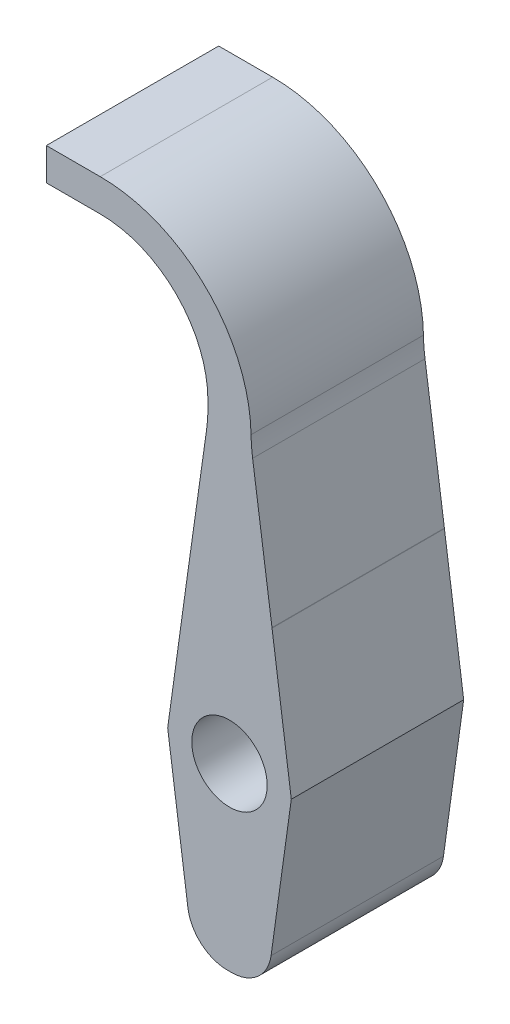
ISO-10303-21;
HEADER;
FILE_DESCRIPTION(('STEP AP214'),'2;1');
FILE_NAME('part.step','',(''),(''),'','','');
FILE_SCHEMA(('AUTOMOTIVE_DESIGN { 1 0 10303 214 1 1 1 1 }'));
ENDSEC;
DATA;
#1=APPLICATION_CONTEXT('core data for automotive mechanical design processes');
#2=APPLICATION_PROTOCOL_DEFINITION('international standard','automotive_design',2000,#1);
#3=PRODUCT_CONTEXT('',#1,'mechanical');
#4=PRODUCT('Part','Part','',(#3));
#5=PRODUCT_RELATED_PRODUCT_CATEGORY('part','',(#4));
#6=PRODUCT_DEFINITION_FORMATION('','',#4);
#7=PRODUCT_DEFINITION_CONTEXT('part definition',#1,'design');
#8=PRODUCT_DEFINITION('design','',#6,#7);
#9=PRODUCT_DEFINITION_SHAPE('','',#8);
#10=(LENGTH_UNIT() NAMED_UNIT(*) SI_UNIT(.MILLI.,.METRE.));
#11=(NAMED_UNIT(*) PLANE_ANGLE_UNIT() SI_UNIT($,.RADIAN.));
#12=(NAMED_UNIT(*) SI_UNIT($,.STERADIAN.) SOLID_ANGLE_UNIT());
#13=UNCERTAINTY_MEASURE_WITH_UNIT(LENGTH_MEASURE(1.E-05),#10,'distance_accuracy_value','');
#14=(GEOMETRIC_REPRESENTATION_CONTEXT(3) GLOBAL_UNCERTAINTY_ASSIGNED_CONTEXT((#13)) GLOBAL_UNIT_ASSIGNED_CONTEXT((#10,
#11,#12)) REPRESENTATION_CONTEXT('',''));
#15=CARTESIAN_POINT('',(0.,0.,0.));
#16=DIRECTION('',(0.,0.,1.));
#17=DIRECTION('',(1.,0.,0.));
#18=AXIS2_PLACEMENT_3D('',#15,#16,#17);
#19=CARTESIAN_POINT('',(-2.,27.7123031282186,-4.));
#20=DIRECTION('',(-1.,0.,0.));
#21=DIRECTION('',(0.,0.,1.));
#22=AXIS2_PLACEMENT_3D('',#19,#20,#21);
#23=PLANE('',#22);
#24=DIRECTION('',(0.,-1.,0.));
#25=VECTOR('',#24,1.);
#26=CARTESIAN_POINT('',(-2.,41.1780435084215,12.));
#27=LINE('',#26,#25);
#28=CARTESIAN_POINT('',(-2.,28.1780435084215,12.));
#29=VERTEX_POINT('',#28);
#30=CARTESIAN_POINT('',(-2.,27.7123031282186,12.));
#31=VERTEX_POINT('',#30);
#32=EDGE_CURVE('E292',#29,#31,#27,.T.);
#33=ORIENTED_EDGE('',*,*,#32,.F.);
#34=DIRECTION('',(0.,0.,1.));
#35=VECTOR('',#34,1.);
#36=CARTESIAN_POINT('',(-2.,28.1780435084215,-4.));
#37=LINE('',#36,#35);
#38=CARTESIAN_POINT('',(-2.,28.1780435084215,-4.));
#39=VERTEX_POINT('',#38);
#40=EDGE_CURVE('E459',#29,#39,#37,.F.);
#41=ORIENTED_EDGE('',*,*,#40,.T.);
#42=DIRECTION('',(0.,-1.,0.));
#43=VECTOR('',#42,1.);
#44=CARTESIAN_POINT('',(-2.,27.7123031282186,-4.));
#45=LINE('',#44,#43);
#46=CARTESIAN_POINT('',(-2.,27.7123031282186,-4.));
#47=VERTEX_POINT('',#46);
#48=EDGE_CURVE('E419',#39,#47,#45,.T.);
#49=ORIENTED_EDGE('',*,*,#48,.T.);
#50=DIRECTION('',(0.,0.,1.));
#51=VECTOR('',#50,1.);
#52=CARTESIAN_POINT('',(-2.,27.7123031282186,-4.));
#53=LINE('',#52,#51);
#54=EDGE_CURVE('E438',#47,#31,#53,.T.);
#55=ORIENTED_EDGE('',*,*,#54,.T.);
#56=EDGE_LOOP('',(#33,#41,#49,#55));
#57=FACE_BOUND('',#56,.T.);
#58=ADVANCED_FACE('F33',(#57),#23,.T.);
#59=CARTESIAN_POINT('',(-5.57909730046481,1.1332098290293,-4.));
#60=DIRECTION('',(-0.990498772938548,0.137521564880675,0.));
#61=DIRECTION('',(-0.137521564880675,-0.990498772938549,0.));
#62=AXIS2_PLACEMENT_3D('',#59,#60,#61);
#63=PLANE('',#62);
#64=DIRECTION('',(0.,0.,1.));
#65=VECTOR('',#64,1.);
#66=CARTESIAN_POINT('',(-5.73643297142574,0.,-4.));
#67=LINE('',#66,#65);
#68=CARTESIAN_POINT('',(-5.73643297142574,0.,-4.));
#69=VERTEX_POINT('',#68);
#70=CARTESIAN_POINT('',(-5.73643297142574,0.,12.));
#71=VERTEX_POINT('',#70);
#72=EDGE_CURVE('E430',#69,#71,#67,.T.);
#73=ORIENTED_EDGE('',*,*,#72,.T.);
#74=DIRECTION('',(-0.137521564880675,-0.990498772938548,0.));
#75=VECTOR('',#74,1.);
#76=CARTESIAN_POINT('',(-3.95049916847756,12.8631843442485,12.));
#77=LINE('',#76,#75);
#78=CARTESIAN_POINT('',(-3.95049916847756,12.8631843442485,12.));
#79=VERTEX_POINT('',#78);
#80=EDGE_CURVE('E261',#79,#71,#77,.T.);
#81=ORIENTED_EDGE('',*,*,#80,.F.);
#82=DIRECTION('',(0.,0.,1.));
#83=VECTOR('',#82,1.);
#84=CARTESIAN_POINT('',(-3.95049916847756,12.8631843442485,-4.));
#85=LINE('',#84,#83);
#86=CARTESIAN_POINT('',(-3.95049916847756,12.8631843442485,-4.));
#87=VERTEX_POINT('',#86);
#88=EDGE_CURVE('E431',#87,#79,#85,.T.);
#89=ORIENTED_EDGE('',*,*,#88,.F.);
#90=DIRECTION('',(-0.137521564880674,-0.990498772938548,0.));
#91=VECTOR('',#90,1.);
#92=CARTESIAN_POINT('',(-5.57909730046481,1.1332098290293,-4.));
#93=LINE('',#92,#91);
#94=EDGE_CURVE('E364',#87,#69,#93,.T.);
#95=ORIENTED_EDGE('',*,*,#94,.T.);
#96=EDGE_LOOP('',(#73,#81,#89,#95));
#97=FACE_BOUND('',#96,.T.);
#98=ADVANCED_FACE('F489',(#97),#63,.T.);
#99=CARTESIAN_POINT('',(10.9069824256007,10.8003608710384,-4.));
#100=DIRECTION('',(0.,0.,1.));
#101=DIRECTION('',(1.,0.,0.));
#102=AXIS2_PLACEMENT_3D('',#99,#100,#101);
#103=CYLINDRICAL_SURFACE('',#102,15.);
#104=ORIENTED_EDGE('',*,*,#88,.T.);
#105=CARTESIAN_POINT('',(10.9069824256007,10.8003608710384,12.));
#106=DIRECTION('',(0.,0.,1.));
#107=DIRECTION('',(1.,0.,0.));
#108=AXIS2_PLACEMENT_3D('',#105,#106,#107);
#109=CIRCLE('',#108,15.);
#110=CARTESIAN_POINT('',(-3.94525945999325,12.9005777578883,12.));
#111=VERTEX_POINT('',#110);
#112=EDGE_CURVE('E257',#111,#79,#109,.T.);
#113=ORIENTED_EDGE('',*,*,#112,.F.);
#114=DIRECTION('',(0.,0.,1.));
#115=VECTOR('',#114,1.);
#116=CARTESIAN_POINT('',(-3.94525945999325,12.9005777578883,-4.));
#117=LINE('',#116,#115);
#118=CARTESIAN_POINT('',(-3.94525945999325,12.9005777578883,-4.));
#119=VERTEX_POINT('',#118);
#120=EDGE_CURVE('E434',#119,#111,#117,.T.);
#121=ORIENTED_EDGE('',*,*,#120,.F.);
#122=CARTESIAN_POINT('',(10.9069824256007,10.8003608710384,-4.));
#123=DIRECTION('',(0.,0.,1.));
#124=DIRECTION('',(-1.,0.,0.));
#125=AXIS2_PLACEMENT_3D('',#122,#123,#124);
#126=CIRCLE('',#125,15.);
#127=EDGE_CURVE('E427',#119,#87,#126,.T.);
#128=ORIENTED_EDGE('',*,*,#127,.T.);
#129=EDGE_LOOP('',(#104,#113,#121,#128));
#130=FACE_BOUND('',#129,.T.);
#131=ADVANCED_FACE('F495',(#130),#103,.T.);
#132=CARTESIAN_POINT('',(-3.94525945999326,12.9005777578883,-4.));
#133=DIRECTION('',(-0.990149459039595,0.140014459123328,0.));
#134=DIRECTION('',(-0.140014459123328,-0.990149459039595,0.));
#135=AXIS2_PLACEMENT_3D('',#132,#133,#134);
#136=PLANE('',#135);
#137=ORIENTED_EDGE('',*,*,#120,.T.);
#138=DIRECTION('',(-0.140014459123327,-0.990149459039595,0.));
#139=VECTOR('',#138,1.);
#140=CARTESIAN_POINT('',(-2.14775811440607,25.6120862413687,12.));
#141=LINE('',#140,#139);
#142=CARTESIAN_POINT('',(-2.14775811440607,25.6120862413687,12.));
#143=VERTEX_POINT('',#142);
#144=EDGE_CURVE('E297',#143,#111,#141,.T.);
#145=ORIENTED_EDGE('',*,*,#144,.F.);
#146=DIRECTION('',(0.,0.,1.));
#147=VECTOR('',#146,1.);
#148=CARTESIAN_POINT('',(-2.14775811440607,25.6120862413687,-4.));
#149=LINE('',#148,#147);
#150=CARTESIAN_POINT('',(-2.14775811440607,25.6120862413687,-4.));
#151=VERTEX_POINT('',#150);
#152=EDGE_CURVE('E436',#151,#143,#149,.T.);
#153=ORIENTED_EDGE('',*,*,#152,.F.);
#154=DIRECTION('',(-0.140014459123328,-0.990149459039595,0.));
#155=VECTOR('',#154,1.);
#156=CARTESIAN_POINT('',(-3.94525945999326,12.9005777578883,-4.));
#157=LINE('',#156,#155);
#158=EDGE_CURVE('E424',#151,#119,#157,.T.);
#159=ORIENTED_EDGE('',*,*,#158,.T.);
#160=EDGE_LOOP('',(#137,#145,#153,#159));
#161=FACE_BOUND('',#160,.T.);
#162=ADVANCED_FACE('F566',(#161),#136,.T.);
#163=CARTESIAN_POINT('',(-17.,27.7123031282186,-4.));
#164=DIRECTION('',(0.,0.,1.));
#165=DIRECTION('',(1.,0.,0.));
#166=AXIS2_PLACEMENT_3D('',#163,#164,#165);
#167=CYLINDRICAL_SURFACE('',#166,15.);
#168=ORIENTED_EDGE('',*,*,#152,.T.);
#169=CARTESIAN_POINT('',(-17.,27.7123031282186,12.));
#170=DIRECTION('',(0.,0.,-1.));
#171=DIRECTION('',(1.,0.,0.));
#172=AXIS2_PLACEMENT_3D('',#169,#170,#171);
#173=CIRCLE('',#172,15.);
#174=EDGE_CURVE('E294',#31,#143,#173,.T.);
#175=ORIENTED_EDGE('',*,*,#174,.F.);
#176=ORIENTED_EDGE('',*,*,#54,.F.);
#177=CARTESIAN_POINT('',(-17.,27.7123031282186,-4.));
#178=DIRECTION('',(0.,0.,-1.));
#179=DIRECTION('',(1.,0.,0.));
#180=AXIS2_PLACEMENT_3D('',#177,#178,#179);
#181=CIRCLE('',#180,15.);
#182=EDGE_CURVE('E421',#47,#151,#181,.T.);
#183=ORIENTED_EDGE('',*,*,#182,.T.);
#184=EDGE_LOOP('',(#168,#175,#176,#183));
#185=FACE_BOUND('',#184,.T.);
#186=ADVANCED_FACE('F501',(#185),#167,.F.);
#187=CARTESIAN_POINT('',(-2.,41.1780435084215,-4.));
#188=DIRECTION('',(0.,1.,0.));
#189=DIRECTION('',(0.,0.,1.));
#190=AXIS2_PLACEMENT_3D('',#187,#188,#189);
#191=PLANE('',#190);
#192=DIRECTION('',(-1.,0.,0.));
#193=VECTOR('',#192,1.);
#194=CARTESIAN_POINT('',(2.,41.1780435084215,12.));
#195=LINE('',#194,#193);
#196=CARTESIAN_POINT('',(-11.9950783178569,41.1780435084215,12.));
#197=VERTEX_POINT('',#196);
#198=CARTESIAN_POINT('',(-17.,41.1780435084215,12.));
#199=VERTEX_POINT('',#198);
#200=EDGE_CURVE('E290',#197,#199,#195,.T.);
#201=ORIENTED_EDGE('',*,*,#200,.F.);
#202=DIRECTION('',(0.,0.,1.));
#203=VECTOR('',#202,1.);
#204=CARTESIAN_POINT('',(-11.9950783178569,41.1780435084215,-4.));
#205=LINE('',#204,#203);
#206=CARTESIAN_POINT('',(-11.9950783178569,41.1780435084215,-4.));
#207=VERTEX_POINT('',#206);
#208=EDGE_CURVE('E41',#197,#207,#205,.F.);
#209=ORIENTED_EDGE('',*,*,#208,.T.);
#210=DIRECTION('',(-1.,0.,0.));
#211=VECTOR('',#210,1.);
#212=CARTESIAN_POINT('',(-2.,41.1780435084215,-4.));
#213=LINE('',#212,#211);
#214=CARTESIAN_POINT('',(-17.,41.1780435084215,-4.));
#215=VERTEX_POINT('',#214);
#216=EDGE_CURVE('E417',#207,#215,#213,.T.);
#217=ORIENTED_EDGE('',*,*,#216,.T.);
#218=DIRECTION('',(0.,0.,-1.));
#219=VECTOR('',#218,1.);
#220=CARTESIAN_POINT('',(-17.,41.1780435084215,-4.));
#221=LINE('',#220,#219);
#222=EDGE_CURVE('E241',#199,#215,#221,.T.);
#223=ORIENTED_EDGE('',*,*,#222,.F.);
#224=EDGE_LOOP('',(#201,#209,#217,#223));
#225=FACE_BOUND('',#224,.T.);
#226=ADVANCED_FACE('F503',(#225),#191,.T.);
#227=CARTESIAN_POINT('',(17.,27.7123031282186,-4.));
#228=DIRECTION('',(0.,0.,1.));
#229=DIRECTION('',(1.,0.,0.));
#230=AXIS2_PLACEMENT_3D('',#227,#228,#229);
#231=CYLINDRICAL_SURFACE('',#230,15.);
#232=CARTESIAN_POINT('',(17.,27.7123031282186,-4.));
#233=DIRECTION('',(0.,0.,-1.));
#234=DIRECTION('',(-1.,0.,0.));
#235=AXIS2_PLACEMENT_3D('',#232,#233,#234);
#236=CIRCLE('',#235,15.);
#237=CARTESIAN_POINT('',(2.14775811440608,25.6120862413687,-4.));
#238=VERTEX_POINT('',#237);
#239=CARTESIAN_POINT('',(2.00254569766023,27.4359619455649,-4.));
#240=VERTEX_POINT('',#239);
#241=EDGE_CURVE('E414',#238,#240,#236,.T.);
#242=ORIENTED_EDGE('',*,*,#241,.T.);
#243=DIRECTION('',(0.,0.,1.));
#244=VECTOR('',#243,1.);
#245=CARTESIAN_POINT('',(2.00254569766023,27.4359619455649,-4.));
#246=LINE('',#245,#244);
#247=CARTESIAN_POINT('',(2.00254569766023,27.4359619455649,12.));
#248=VERTEX_POINT('',#247);
#249=EDGE_CURVE('E464',#240,#248,#246,.T.);
#250=ORIENTED_EDGE('',*,*,#249,.T.);
#251=CARTESIAN_POINT('',(17.,27.7123031282186,12.));
#252=DIRECTION('',(0.,0.,-1.));
#253=DIRECTION('',(1.,0.,0.));
#254=AXIS2_PLACEMENT_3D('',#251,#252,#253);
#255=CIRCLE('',#254,15.);
#256=CARTESIAN_POINT('',(2.14775811440608,25.6120862413687,12.));
#257=VERTEX_POINT('',#256);
#258=EDGE_CURVE('E288',#257,#248,#255,.T.);
#259=ORIENTED_EDGE('',*,*,#258,.F.);
#260=DIRECTION('',(0.,0.,1.));
#261=VECTOR('',#260,1.);
#262=CARTESIAN_POINT('',(2.14775811440608,25.6120862413687,-4.));
#263=LINE('',#262,#261);
#264=EDGE_CURVE('E441',#238,#257,#263,.T.);
#265=ORIENTED_EDGE('',*,*,#264,.F.);
#266=EDGE_LOOP('',(#242,#250,#259,#265));
#267=FACE_BOUND('',#266,.T.);
#268=ADVANCED_FACE('F470',(#267),#231,.F.);
#269=CARTESIAN_POINT('',(3.94525945999325,12.9005777578883,-4.));
#270=DIRECTION('',(0.990149459039595,0.140014459123327,0.));
#271=DIRECTION('',(-0.140014459123327,0.990149459039595,0.));
#272=AXIS2_PLACEMENT_3D('',#269,#270,#271);
#273=PLANE('',#272);
#274=ORIENTED_EDGE('',*,*,#264,.T.);
#275=DIRECTION('',(-0.140014459123327,0.990149459039595,0.));
#276=VECTOR('',#275,1.);
#277=CARTESIAN_POINT('',(3.94525945999325,12.9005777578883,12.));
#278=LINE('',#277,#276);
#279=CARTESIAN_POINT('',(3.94525945999325,12.9005777578883,12.));
#280=VERTEX_POINT('',#279);
#281=EDGE_CURVE('E285',#280,#257,#278,.T.);
#282=ORIENTED_EDGE('',*,*,#281,.F.);
#283=DIRECTION('',(0.,0.,1.));
#284=VECTOR('',#283,1.);
#285=CARTESIAN_POINT('',(3.94525945999325,12.9005777578883,-4.));
#286=LINE('',#285,#284);
#287=CARTESIAN_POINT('',(3.94525945999325,12.9005777578883,-4.));
#288=VERTEX_POINT('',#287);
#289=EDGE_CURVE('E443',#288,#280,#286,.T.);
#290=ORIENTED_EDGE('',*,*,#289,.F.);
#291=DIRECTION('',(-0.140014459123327,0.990149459039595,0.));
#292=VECTOR('',#291,1.);
#293=CARTESIAN_POINT('',(3.94525945999325,12.9005777578883,-4.));
#294=LINE('',#293,#292);
#295=EDGE_CURVE('E411',#288,#238,#294,.T.);
#296=ORIENTED_EDGE('',*,*,#295,.T.);
#297=EDGE_LOOP('',(#274,#282,#290,#296));
#298=FACE_BOUND('',#297,.T.);
#299=ADVANCED_FACE('F479',(#298),#273,.T.);
#300=CARTESIAN_POINT('',(-10.9069824256007,10.8003608710384,-4.));
#301=DIRECTION('',(0.,0.,1.));
#302=DIRECTION('',(1.,0.,0.));
#303=AXIS2_PLACEMENT_3D('',#300,#301,#302);
#304=CYLINDRICAL_SURFACE('',#303,15.);
#305=ORIENTED_EDGE('',*,*,#289,.T.);
#306=CARTESIAN_POINT('',(-10.9069824256007,10.8003608710384,12.));
#307=DIRECTION('',(0.,0.,1.));
#308=DIRECTION('',(1.,0.,0.));
#309=AXIS2_PLACEMENT_3D('',#306,#307,#308);
#310=CIRCLE('',#309,15.);
#311=CARTESIAN_POINT('',(3.95049916847756,12.8631843442485,12.));
#312=VERTEX_POINT('',#311);
#313=EDGE_CURVE('E282',#312,#280,#310,.T.);
#314=ORIENTED_EDGE('',*,*,#313,.F.);
#315=DIRECTION('',(0.,0.,1.));
#316=VECTOR('',#315,1.);
#317=CARTESIAN_POINT('',(3.95049916847756,12.8631843442485,-4.));
#318=LINE('',#317,#316);
#319=CARTESIAN_POINT('',(3.95049916847756,12.8631843442485,-4.));
#320=VERTEX_POINT('',#319);
#321=EDGE_CURVE('E445',#320,#312,#318,.T.);
#322=ORIENTED_EDGE('',*,*,#321,.F.);
#323=CARTESIAN_POINT('',(-10.9069824256007,10.8003608710384,-4.));
#324=DIRECTION('',(0.,0.,1.));
#325=DIRECTION('',(-1.,0.,0.));
#326=AXIS2_PLACEMENT_3D('',#323,#324,#325);
#327=CIRCLE('',#326,15.);
#328=EDGE_CURVE('E408',#320,#288,#327,.T.);
#329=ORIENTED_EDGE('',*,*,#328,.T.);
#330=EDGE_LOOP('',(#305,#314,#322,#329));
#331=FACE_BOUND('',#330,.T.);
#332=ADVANCED_FACE('F510',(#331),#304,.T.);
#333=CARTESIAN_POINT('',(3.95049916847756,12.8631843442485,-4.));
#334=DIRECTION('',(0.990498772938548,0.137521564880675,0.));
#335=DIRECTION('',(-0.137521564880675,0.990498772938549,0.));
#336=AXIS2_PLACEMENT_3D('',#333,#334,#335);
#337=PLANE('',#336);
#338=ORIENTED_EDGE('',*,*,#321,.T.);
#339=DIRECTION('',(-0.137521564880675,0.990498772938548,0.));
#340=VECTOR('',#339,1.);
#341=CARTESIAN_POINT('',(5.73643297142574,0.,12.));
#342=LINE('',#341,#340);
#343=CARTESIAN_POINT('',(5.73643297142574,0.,12.));
#344=VERTEX_POINT('',#343);
#345=EDGE_CURVE('E279',#344,#312,#342,.T.);
#346=ORIENTED_EDGE('',*,*,#345,.F.);
#347=DIRECTION('',(0.,0.,1.));
#348=VECTOR('',#347,1.);
#349=CARTESIAN_POINT('',(5.73643297142574,0.,-4.));
#350=LINE('',#349,#348);
#351=CARTESIAN_POINT('',(5.73643297142574,0.,-4.));
#352=VERTEX_POINT('',#351);
#353=EDGE_CURVE('E447',#352,#344,#350,.T.);
#354=ORIENTED_EDGE('',*,*,#353,.F.);
#355=DIRECTION('',(-0.137521564880673,0.990498772938549,0.));
#356=VECTOR('',#355,1.);
#357=CARTESIAN_POINT('',(5.57909730046481,1.13320982902929,-4.));
#358=LINE('',#357,#356);
#359=EDGE_CURVE('E406',#352,#320,#358,.T.);
#360=ORIENTED_EDGE('',*,*,#359,.T.);
#361=EDGE_LOOP('',(#338,#346,#354,#360));
#362=FACE_BOUND('',#361,.T.);
#363=ADVANCED_FACE('F513',(#362),#337,.T.);
#364=CARTESIAN_POINT('',(5.73643297142574,0.,-4.));
#365=DIRECTION('',(0.990498772938548,-0.137521564880675,0.));
#366=DIRECTION('',(0.137521564880675,0.990498772938549,0.));
#367=AXIS2_PLACEMENT_3D('',#364,#365,#366);
#368=PLANE('',#367);
#369=ORIENTED_EDGE('',*,*,#353,.T.);
#370=DIRECTION('',(0.137521564880675,0.990498772938548,0.));
#371=VECTOR('',#370,1.);
#372=CARTESIAN_POINT('',(3.86085728855634,-13.5088297900585,12.));
#373=LINE('',#372,#371);
#374=CARTESIAN_POINT('',(3.86085728855634,-13.5088297900585,12.));
#375=VERTEX_POINT('',#374);
#376=EDGE_CURVE('E276',#375,#344,#373,.T.);
#377=ORIENTED_EDGE('',*,*,#376,.F.);
#378=DIRECTION('',(0.,0.,1.));
#379=VECTOR('',#378,1.);
#380=CARTESIAN_POINT('',(3.86085728855634,-13.5088297900585,-4.));
#381=LINE('',#380,#379);
#382=CARTESIAN_POINT('',(3.86085728855634,-13.5088297900585,-4.));
#383=VERTEX_POINT('',#382);
#384=EDGE_CURVE('E449',#383,#375,#381,.T.);
#385=ORIENTED_EDGE('',*,*,#384,.F.);
#386=DIRECTION('',(0.137521564880675,0.990498772938548,0.));
#387=VECTOR('',#386,1.);
#388=CARTESIAN_POINT('',(3.86085728855634,-13.5088297900585,-4.));
#389=LINE('',#388,#387);
#390=EDGE_CURVE('E404',#383,#352,#389,.T.);
#391=ORIENTED_EDGE('',*,*,#390,.T.);
#392=EDGE_LOOP('',(#369,#377,#385,#391));
#393=FACE_BOUND('',#392,.T.);
#394=ADVANCED_FACE('F517',(#393),#368,.T.);
#395=CARTESIAN_POINT('',(0.196011828683711,-13.,-4.));
#396=DIRECTION('',(0.,0.,1.));
#397=DIRECTION('',(1.,0.,0.));
#398=AXIS2_PLACEMENT_3D('',#395,#396,#397);
#399=CYLINDRICAL_SURFACE('',#398,3.7);
#400=ORIENTED_EDGE('',*,*,#384,.T.);
#401=CARTESIAN_POINT('',(0.196011828683711,-13.,12.));
#402=DIRECTION('',(0.,0.,1.));
#403=DIRECTION('',(1.,0.,0.));
#404=AXIS2_PLACEMENT_3D('',#401,#402,#403);
#405=CIRCLE('',#404,3.7);
#406=CARTESIAN_POINT('',(0.196011828683688,-16.7,12.));
#407=VERTEX_POINT('',#406);
#408=EDGE_CURVE('E273',#407,#375,#405,.T.);
#409=ORIENTED_EDGE('',*,*,#408,.F.);
#410=DIRECTION('',(0.,0.,1.));
#411=VECTOR('',#410,1.);
#412=CARTESIAN_POINT('',(0.196011828683688,-16.7,-4.));
#413=LINE('',#412,#411);
#414=CARTESIAN_POINT('',(0.196011828683688,-16.7,-4.));
#415=VERTEX_POINT('',#414);
#416=EDGE_CURVE('E451',#415,#407,#413,.T.);
#417=ORIENTED_EDGE('',*,*,#416,.F.);
#418=CARTESIAN_POINT('',(0.196011828683711,-13.,-4.));
#419=DIRECTION('',(0.,0.,1.));
#420=DIRECTION('',(-1.,0.,0.));
#421=AXIS2_PLACEMENT_3D('',#418,#419,#420);
#422=CIRCLE('',#421,3.7);
#423=EDGE_CURVE('E401',#415,#383,#422,.T.);
#424=ORIENTED_EDGE('',*,*,#423,.T.);
#425=EDGE_LOOP('',(#400,#409,#417,#424));
#426=FACE_BOUND('',#425,.T.);
#427=ADVANCED_FACE('F521',(#426),#399,.T.);
#428=CARTESIAN_POINT('',(-0.196011828683702,-16.7,-4.));
#429=DIRECTION('',(0.,-1.,0.));
#430=DIRECTION('',(0.,0.,-1.));
#431=AXIS2_PLACEMENT_3D('',#428,#429,#430);
#432=PLANE('',#431);
#433=ORIENTED_EDGE('',*,*,#416,.T.);
#434=DIRECTION('',(1.,0.,0.));
#435=VECTOR('',#434,1.);
#436=CARTESIAN_POINT('',(-0.196011828683705,-16.7,12.));
#437=LINE('',#436,#435);
#438=CARTESIAN_POINT('',(-0.196011828683705,-16.7,12.));
#439=VERTEX_POINT('',#438);
#440=EDGE_CURVE('E270',#439,#407,#437,.T.);
#441=ORIENTED_EDGE('',*,*,#440,.F.);
#442=DIRECTION('',(0.,0.,1.));
#443=VECTOR('',#442,1.);
#444=CARTESIAN_POINT('',(-0.196011828683702,-16.7,-4.));
#445=LINE('',#444,#443);
#446=CARTESIAN_POINT('',(-0.196011828683702,-16.7,-4.));
#447=VERTEX_POINT('',#446);
#448=EDGE_CURVE('E453',#447,#439,#445,.T.);
#449=ORIENTED_EDGE('',*,*,#448,.F.);
#450=DIRECTION('',(1.,0.,0.));
#451=VECTOR('',#450,1.);
#452=CARTESIAN_POINT('',(-0.196011828683702,-16.7,-4.));
#453=LINE('',#452,#451);
#454=EDGE_CURVE('E398',#447,#415,#453,.T.);
#455=ORIENTED_EDGE('',*,*,#454,.T.);
#456=EDGE_LOOP('',(#433,#441,#449,#455));
#457=FACE_BOUND('',#456,.T.);
#458=ADVANCED_FACE('F525',(#457),#432,.T.);
#459=CARTESIAN_POINT('',(-0.196011828683711,-13.,-4.));
#460=DIRECTION('',(0.,0.,1.));
#461=DIRECTION('',(1.,0.,0.));
#462=AXIS2_PLACEMENT_3D('',#459,#460,#461);
#463=CYLINDRICAL_SURFACE('',#462,3.7);
#464=ORIENTED_EDGE('',*,*,#448,.T.);
#465=CARTESIAN_POINT('',(-0.196011828683711,-13.,12.));
#466=DIRECTION('',(0.,0.,1.));
#467=DIRECTION('',(1.,0.,0.));
#468=AXIS2_PLACEMENT_3D('',#465,#466,#467);
#469=CIRCLE('',#468,3.7);
#470=CARTESIAN_POINT('',(-3.86085728855634,-13.5088297900585,12.));
#471=VERTEX_POINT('',#470);
#472=EDGE_CURVE('E267',#471,#439,#469,.T.);
#473=ORIENTED_EDGE('',*,*,#472,.F.);
#474=DIRECTION('',(0.,0.,1.));
#475=VECTOR('',#474,1.);
#476=CARTESIAN_POINT('',(-3.86085728855634,-13.5088297900585,-4.));
#477=LINE('',#476,#475);
#478=CARTESIAN_POINT('',(-3.86085728855634,-13.5088297900585,-4.));
#479=VERTEX_POINT('',#478);
#480=EDGE_CURVE('E455',#479,#471,#477,.T.);
#481=ORIENTED_EDGE('',*,*,#480,.F.);
#482=CARTESIAN_POINT('',(-0.196011828683711,-13.,-4.));
#483=DIRECTION('',(0.,0.,1.));
#484=DIRECTION('',(-1.,0.,0.));
#485=AXIS2_PLACEMENT_3D('',#482,#483,#484);
#486=CIRCLE('',#485,3.7);
#487=EDGE_CURVE('E395',#479,#447,#486,.T.);
#488=ORIENTED_EDGE('',*,*,#487,.T.);
#489=EDGE_LOOP('',(#464,#473,#481,#488));
#490=FACE_BOUND('',#489,.T.);
#491=ADVANCED_FACE('F529',(#490),#463,.T.);
#492=CARTESIAN_POINT('',(-5.57909730046481,-1.1332098290293,-4.));
#493=DIRECTION('',(-0.990498772938548,-0.137521564880675,0.));
#494=DIRECTION('',(0.137521564880675,-0.990498772938549,0.));
#495=AXIS2_PLACEMENT_3D('',#492,#493,#494);
#496=PLANE('',#495);
#497=ORIENTED_EDGE('',*,*,#480,.T.);
#498=DIRECTION('',(0.137521564880675,-0.990498772938549,0.));
#499=VECTOR('',#498,1.);
#500=CARTESIAN_POINT('',(-5.73643297142574,0.,12.));
#501=LINE('',#500,#499);
#502=EDGE_CURVE('E264',#71,#471,#501,.T.);
#503=ORIENTED_EDGE('',*,*,#502,.F.);
#504=ORIENTED_EDGE('',*,*,#72,.F.);
#505=DIRECTION('',(0.137521564880675,-0.990498772938548,0.));
#506=VECTOR('',#505,1.);
#507=CARTESIAN_POINT('',(-5.73643297142574,0.,-4.));
#508=LINE('',#507,#506);
#509=EDGE_CURVE('E393',#69,#479,#508,.T.);
#510=ORIENTED_EDGE('',*,*,#509,.T.);
#511=EDGE_LOOP('',(#497,#503,#504,#510));
#512=FACE_BOUND('',#511,.T.);
#513=ADVANCED_FACE('F533',(#512),#496,.T.);
#514=CARTESIAN_POINT('',(-0.196011828683711,-13.,-4.));
#515=DIRECTION('',(0.,0.,-1.));
#516=DIRECTION('',(-1.,0.,0.));
#517=AXIS2_PLACEMENT_3D('',#514,#515,#516);
#518=PLANE('',#517);
#519=CARTESIAN_POINT('',(-0.196011828683711,-13.,-4.));
#520=DIRECTION('',(0.,0.,1.));
#521=DIRECTION('',(-1.,0.,0.));
#522=AXIS2_PLACEMENT_3D('',#519,#520,#521);
#523=CIRCLE('',#522,1.7);
#524=CARTESIAN_POINT('',(-1.87985974267924,-13.2337866602971,-4.));
#525=VERTEX_POINT('',#524);
#526=CARTESIAN_POINT('',(-0.196011828683702,-14.7,-4.));
#527=VERTEX_POINT('',#526);
#528=EDGE_CURVE('E301',#525,#527,#523,.T.);
#529=ORIENTED_EDGE('',*,*,#528,.T.);
#530=DIRECTION('',(1.,0.,0.));
#531=VECTOR('',#530,1.);
#532=CARTESIAN_POINT('',(-0.196011828683702,-14.7,-4.));
#533=LINE('',#532,#531);
#534=CARTESIAN_POINT('',(0.196011828683701,-14.7,-4.));
#535=VERTEX_POINT('',#534);
#536=EDGE_CURVE('E304',#527,#535,#533,.T.);
#537=ORIENTED_EDGE('',*,*,#536,.T.);
#538=CARTESIAN_POINT('',(0.196011828683711,-13.,-4.));
#539=DIRECTION('',(0.,0.,1.));
#540=DIRECTION('',(-1.,0.,0.));
#541=AXIS2_PLACEMENT_3D('',#538,#539,#540);
#542=CIRCLE('',#541,1.7);
#543=CARTESIAN_POINT('',(1.87985974267924,-13.2337866602971,-4.));
#544=VERTEX_POINT('',#543);
#545=EDGE_CURVE('E308',#535,#544,#542,.T.);
#546=ORIENTED_EDGE('',*,*,#545,.T.);
#547=DIRECTION('',(0.137521564880675,0.990498772938548,0.));
#548=VECTOR('',#547,1.);
#549=CARTESIAN_POINT('',(1.87985974267924,-13.2337866602971,-4.));
#550=LINE('',#549,#548);
#551=CARTESIAN_POINT('',(3.71724823880207,0.,-4.));
#552=VERTEX_POINT('',#551);
#553=EDGE_CURVE('E311',#544,#552,#550,.T.);
#554=ORIENTED_EDGE('',*,*,#553,.T.);
#555=DIRECTION('',(-0.137521564880675,0.990498772938549,0.));
#556=VECTOR('',#555,1.);
#557=CARTESIAN_POINT('',(3.59809975458771,0.858166699267939,-4.));
#558=LINE('',#557,#556);
#559=CARTESIAN_POINT('',(1.87985974267924,13.2337866602971,-4.));
#560=VERTEX_POINT('',#559);
#561=EDGE_CURVE('E314',#552,#560,#558,.T.);
#562=ORIENTED_EDGE('',*,*,#561,.T.);
#563=CARTESIAN_POINT('',(0.196011828683711,13.,-4.));
#564=DIRECTION('',(0.,0.,1.));
#565=DIRECTION('',(1.,0.,0.));
#566=AXIS2_PLACEMENT_3D('',#563,#564,#565);
#567=CIRCLE('',#566,1.7);
#568=CARTESIAN_POINT('',(0.196011828683701,14.7,-4.));
#569=VERTEX_POINT('',#568);
#570=EDGE_CURVE('E317',#560,#569,#567,.T.);
#571=ORIENTED_EDGE('',*,*,#570,.T.);
#572=DIRECTION('',(-1.,0.,0.));
#573=VECTOR('',#572,1.);
#574=CARTESIAN_POINT('',(-0.196011828683702,14.7,-4.));
#575=LINE('',#574,#573);
#576=CARTESIAN_POINT('',(-0.196011828683702,14.7,-4.));
#577=VERTEX_POINT('',#576);
#578=EDGE_CURVE('E320',#569,#577,#575,.T.);
#579=ORIENTED_EDGE('',*,*,#578,.T.);
#580=CARTESIAN_POINT('',(-0.196011828683711,13.,-4.));
#581=DIRECTION('',(0.,0.,1.));
#582=DIRECTION('',(1.,0.,0.));
#583=AXIS2_PLACEMENT_3D('',#580,#581,#582);
#584=CIRCLE('',#583,1.7);
#585=CARTESIAN_POINT('',(-1.87985974267924,13.2337866602971,-4.));
#586=VERTEX_POINT('',#585);
#587=EDGE_CURVE('E323',#577,#586,#584,.T.);
#588=ORIENTED_EDGE('',*,*,#587,.T.);
#589=DIRECTION('',(-0.137521564880675,-0.990498772938549,0.));
#590=VECTOR('',#589,1.);
#591=CARTESIAN_POINT('',(-3.59809975458771,0.858166699267946,-4.));
#592=LINE('',#591,#590);
#593=CARTESIAN_POINT('',(-3.71724823880207,0.,-4.));
#594=VERTEX_POINT('',#593);
#595=EDGE_CURVE('E326',#586,#594,#592,.T.);
#596=ORIENTED_EDGE('',*,*,#595,.T.);
#597=DIRECTION('',(0.137521564880674,-0.990498772938548,0.));
#598=VECTOR('',#597,1.);
#599=CARTESIAN_POINT('',(-3.71724823880207,0.,-4.));
#600=LINE('',#599,#598);
#601=EDGE_CURVE('E329',#594,#525,#600,.T.);
#602=ORIENTED_EDGE('',*,*,#601,.T.);
#603=EDGE_LOOP('',(#529,#537,#546,#554,#562,#571,#579,#588,#596,#602));
#604=FACE_BOUND('',#603,.T.);
#605=ORIENTED_EDGE('',*,*,#216,.F.);
#606=CARTESIAN_POINT('',(-11.9950783178569,27.1780435084215,-4.));
#607=DIRECTION('',(0.,0.,-1.));
#608=DIRECTION('',(-1.,0.,0.));
#609=AXIS2_PLACEMENT_3D('',#606,#607,#608);
#610=CIRCLE('',#609,14.);
#611=EDGE_CURVE('E11',#207,#240,#610,.T.);
#612=ORIENTED_EDGE('',*,*,#611,.T.);
#613=ORIENTED_EDGE('',*,*,#241,.F.);
#614=ORIENTED_EDGE('',*,*,#295,.F.);
#615=ORIENTED_EDGE('',*,*,#328,.F.);
#616=ORIENTED_EDGE('',*,*,#359,.F.);
#617=ORIENTED_EDGE('',*,*,#390,.F.);
#618=ORIENTED_EDGE('',*,*,#423,.F.);
#619=ORIENTED_EDGE('',*,*,#454,.F.);
#620=ORIENTED_EDGE('',*,*,#487,.F.);
#621=ORIENTED_EDGE('',*,*,#509,.F.);
#622=ORIENTED_EDGE('',*,*,#94,.F.);
#623=ORIENTED_EDGE('',*,*,#127,.F.);
#624=ORIENTED_EDGE('',*,*,#158,.F.);
#625=ORIENTED_EDGE('',*,*,#182,.F.);
#626=ORIENTED_EDGE('',*,*,#48,.F.);
#627=CARTESIAN_POINT('',(-12.,28.1780435084215,-4.));
#628=DIRECTION('',(0.,0.,-1.));
#629=DIRECTION('',(-1.,0.,0.));
#630=AXIS2_PLACEMENT_3D('',#627,#628,#629);
#631=CIRCLE('',#630,10.);
#632=CARTESIAN_POINT('',(-12.,38.1780435084215,-4.));
#633=VERTEX_POINT('',#632);
#634=EDGE_CURVE('E247',#39,#633,#631,.F.);
#635=ORIENTED_EDGE('',*,*,#634,.T.);
#636=DIRECTION('',(1.,0.,0.));
#637=VECTOR('',#636,1.);
#638=CARTESIAN_POINT('',(-17.,38.1780435084215,-4.));
#639=LINE('',#638,#637);
#640=CARTESIAN_POINT('',(-17.,38.1780435084215,-4.));
#641=VERTEX_POINT('',#640);
#642=EDGE_CURVE('E227',#641,#633,#639,.T.);
#643=ORIENTED_EDGE('',*,*,#642,.F.);
#644=DIRECTION('',(0.,-1.,0.));
#645=VECTOR('',#644,1.);
#646=CARTESIAN_POINT('',(-17.,41.1780435084215,-4.));
#647=LINE('',#646,#645);
#648=EDGE_CURVE('E235',#215,#641,#647,.T.);
#649=ORIENTED_EDGE('',*,*,#648,.F.);
#650=EDGE_LOOP('',(#605,#612,#613,#614,#615,#616,#617,#618,#619,#620,#621,#622,#623,#624,#625,
#626,#635,#643,#649));
#651=FACE_BOUND('',#650,.T.);
#652=ADVANCED_FACE('F244',(#604,#651),#518,.T.);
#653=CARTESIAN_POINT('',(-0.196011828683711,-13.,-4.));
#654=DIRECTION('',(0.,0.,1.));
#655=DIRECTION('',(1.,0.,0.));
#656=AXIS2_PLACEMENT_3D('',#653,#654,#655);
#657=CYLINDRICAL_SURFACE('',#656,1.7);
#658=CARTESIAN_POINT('',(-0.196011828683711,-13.,0.));
#659=DIRECTION('',(0.,0.,1.));
#660=DIRECTION('',(-1.,0.,0.));
#661=AXIS2_PLACEMENT_3D('',#658,#659,#660);
#662=CIRCLE('',#661,1.7);
#663=CARTESIAN_POINT('',(-1.87985974267924,-13.2337866602971,0.));
#664=VERTEX_POINT('',#663);
#665=CARTESIAN_POINT('',(-0.196011828683702,-14.7,0.));
#666=VERTEX_POINT('',#665);
#667=EDGE_CURVE('E300',#664,#666,#662,.T.);
#668=ORIENTED_EDGE('',*,*,#667,.T.);
#669=DIRECTION('',(0.,0.,1.));
#670=VECTOR('',#669,1.);
#671=CARTESIAN_POINT('',(-0.196011828683702,-14.7,-4.));
#672=LINE('',#671,#670);
#673=EDGE_CURVE('E332',#527,#666,#672,.T.);
#674=ORIENTED_EDGE('',*,*,#673,.F.);
#675=ORIENTED_EDGE('',*,*,#528,.F.);
#676=DIRECTION('',(0.,0.,1.));
#677=VECTOR('',#676,1.);
#678=CARTESIAN_POINT('',(-1.87985974267924,-13.2337866602971,-4.));
#679=LINE('',#678,#677);
#680=EDGE_CURVE('E361',#525,#664,#679,.T.);
#681=ORIENTED_EDGE('',*,*,#680,.T.);
#682=EDGE_LOOP('',(#668,#674,#675,#681));
#683=FACE_BOUND('',#682,.T.);
#684=ADVANCED_FACE('F540',(#683),#657,.F.);
#685=CARTESIAN_POINT('',(-3.59809975458771,-0.858166699267946,-4.));
#686=DIRECTION('',(-0.990498772938548,-0.137521564880675,0.));
#687=DIRECTION('',(0.137521564880675,-0.990498772938549,0.));
#688=AXIS2_PLACEMENT_3D('',#685,#686,#687);
#689=PLANE('',#688);
#690=DIRECTION('',(0.137521564880675,-0.990498772938549,0.));
#691=VECTOR('',#690,1.);
#692=CARTESIAN_POINT('',(-3.59809975458771,-0.858166699267946,0.));
#693=LINE('',#692,#691);
#694=CARTESIAN_POINT('',(-3.71724823880207,0.,0.));
#695=VERTEX_POINT('',#694);
#696=EDGE_CURVE('E305',#695,#664,#693,.T.);
#697=ORIENTED_EDGE('',*,*,#696,.T.);
#698=ORIENTED_EDGE('',*,*,#680,.F.);
#699=ORIENTED_EDGE('',*,*,#601,.F.);
#700=DIRECTION('',(0.,0.,1.));
#701=VECTOR('',#700,1.);
#702=CARTESIAN_POINT('',(-3.71724823880207,0.,-4.));
#703=LINE('',#702,#701);
#704=EDGE_CURVE('E365',#594,#695,#703,.T.);
#705=ORIENTED_EDGE('',*,*,#704,.T.);
#706=EDGE_LOOP('',(#697,#698,#699,#705));
#707=FACE_BOUND('',#706,.T.);
#708=ADVANCED_FACE('F584',(#707),#689,.F.);
#709=CARTESIAN_POINT('',(-3.59809975458771,0.858166699267946,-4.));
#710=DIRECTION('',(-0.990498772938549,0.137521564880674,0.));
#711=DIRECTION('',(-0.137521564880674,-0.990498772938549,0.));
#712=AXIS2_PLACEMENT_3D('',#709,#710,#711);
#713=PLANE('',#712);
#714=DIRECTION('',(-0.137521564880674,-0.990498772938548,0.));
#715=VECTOR('',#714,1.);
#716=CARTESIAN_POINT('',(-3.59809975458771,0.858166699267946,0.));
#717=LINE('',#716,#715);
#718=CARTESIAN_POINT('',(-1.87985974267924,13.2337866602971,0.));
#719=VERTEX_POINT('',#718);
#720=EDGE_CURVE('E356',#719,#695,#717,.T.);
#721=ORIENTED_EDGE('',*,*,#720,.T.);
#722=ORIENTED_EDGE('',*,*,#704,.F.);
#723=ORIENTED_EDGE('',*,*,#595,.F.);
#724=DIRECTION('',(0.,0.,1.));
#725=VECTOR('',#724,1.);
#726=CARTESIAN_POINT('',(-1.87985974267924,13.2337866602971,-4.));
#727=LINE('',#726,#725);
#728=EDGE_CURVE('E368',#586,#719,#727,.T.);
#729=ORIENTED_EDGE('',*,*,#728,.T.);
#730=EDGE_LOOP('',(#721,#722,#723,#729));
#731=FACE_BOUND('',#730,.T.);
#732=ADVANCED_FACE('F614',(#731),#713,.F.);
#733=CARTESIAN_POINT('',(-0.196011828683711,13.,-4.));
#734=DIRECTION('',(0.,0.,1.));
#735=DIRECTION('',(1.,0.,0.));
#736=AXIS2_PLACEMENT_3D('',#733,#734,#735);
#737=CYLINDRICAL_SURFACE('',#736,1.7);
#738=CARTESIAN_POINT('',(-0.196011828683711,13.,0.));
#739=DIRECTION('',(0.,0.,1.));
#740=DIRECTION('',(1.,0.,0.));
#741=AXIS2_PLACEMENT_3D('',#738,#739,#740);
#742=CIRCLE('',#741,1.7);
#743=CARTESIAN_POINT('',(-0.196011828683702,14.7,0.));
#744=VERTEX_POINT('',#743);
#745=EDGE_CURVE('E353',#744,#719,#742,.T.);
#746=ORIENTED_EDGE('',*,*,#745,.T.);
#747=ORIENTED_EDGE('',*,*,#728,.F.);
#748=ORIENTED_EDGE('',*,*,#587,.F.);
#749=DIRECTION('',(0.,0.,1.));
#750=VECTOR('',#749,1.);
#751=CARTESIAN_POINT('',(-0.196011828683702,14.7,-4.));
#752=LINE('',#751,#750);
#753=EDGE_CURVE('E371',#577,#744,#752,.T.);
#754=ORIENTED_EDGE('',*,*,#753,.T.);
#755=EDGE_LOOP('',(#746,#747,#748,#754));
#756=FACE_BOUND('',#755,.T.);
#757=ADVANCED_FACE('F610',(#756),#737,.F.);
#758=CARTESIAN_POINT('',(-0.196011828683702,14.7,-4.));
#759=DIRECTION('',(0.,1.,0.));
#760=DIRECTION('',(0.,0.,1.));
#761=AXIS2_PLACEMENT_3D('',#758,#759,#760);
#762=PLANE('',#761);
#763=DIRECTION('',(-1.,0.,0.));
#764=VECTOR('',#763,1.);
#765=CARTESIAN_POINT('',(-0.196011828683702,14.7,0.));
#766=LINE('',#765,#764);
#767=CARTESIAN_POINT('',(0.196011828683701,14.7,0.));
#768=VERTEX_POINT('',#767);
#769=EDGE_CURVE('E350',#768,#744,#766,.T.);
#770=ORIENTED_EDGE('',*,*,#769,.T.);
#771=ORIENTED_EDGE('',*,*,#753,.F.);
#772=ORIENTED_EDGE('',*,*,#578,.F.);
#773=DIRECTION('',(0.,0.,1.));
#774=VECTOR('',#773,1.);
#775=CARTESIAN_POINT('',(0.196011828683701,14.7,-4.));
#776=LINE('',#775,#774);
#777=EDGE_CURVE('E374',#569,#768,#776,.T.);
#778=ORIENTED_EDGE('',*,*,#777,.T.);
#779=EDGE_LOOP('',(#770,#771,#772,#778));
#780=FACE_BOUND('',#779,.T.);
#781=ADVANCED_FACE('F606',(#780),#762,.F.);
#782=CARTESIAN_POINT('',(0.196011828683711,13.,-4.));
#783=DIRECTION('',(0.,0.,1.));
#784=DIRECTION('',(1.,0.,0.));
#785=AXIS2_PLACEMENT_3D('',#782,#783,#784);
#786=CYLINDRICAL_SURFACE('',#785,1.7);
#787=CARTESIAN_POINT('',(0.196011828683711,13.,0.));
#788=DIRECTION('',(0.,0.,1.));
#789=DIRECTION('',(1.,0.,0.));
#790=AXIS2_PLACEMENT_3D('',#787,#788,#789);
#791=CIRCLE('',#790,1.7);
#792=CARTESIAN_POINT('',(1.87985974267924,13.2337866602971,0.));
#793=VERTEX_POINT('',#792);
#794=EDGE_CURVE('E347',#793,#768,#791,.T.);
#795=ORIENTED_EDGE('',*,*,#794,.T.);
#796=ORIENTED_EDGE('',*,*,#777,.F.);
#797=ORIENTED_EDGE('',*,*,#570,.F.);
#798=DIRECTION('',(0.,0.,1.));
#799=VECTOR('',#798,1.);
#800=CARTESIAN_POINT('',(1.87985974267924,13.2337866602971,-4.));
#801=LINE('',#800,#799);
#802=EDGE_CURVE('E377',#560,#793,#801,.T.);
#803=ORIENTED_EDGE('',*,*,#802,.T.);
#804=EDGE_LOOP('',(#795,#796,#797,#803));
#805=FACE_BOUND('',#804,.T.);
#806=ADVANCED_FACE('F602',(#805),#786,.F.);
#807=CARTESIAN_POINT('',(1.87985974267924,13.2337866602971,-4.));
#808=DIRECTION('',(0.990498772938548,0.137521564880675,0.));
#809=DIRECTION('',(-0.137521564880675,0.990498772938549,0.));
#810=AXIS2_PLACEMENT_3D('',#807,#808,#809);
#811=PLANE('',#810);
#812=DIRECTION('',(-0.137521564880675,0.990498772938548,0.));
#813=VECTOR('',#812,1.);
#814=CARTESIAN_POINT('',(1.87985974267924,13.2337866602971,0.));
#815=LINE('',#814,#813);
#816=CARTESIAN_POINT('',(3.71724823880207,0.,0.));
#817=VERTEX_POINT('',#816);
#818=EDGE_CURVE('E344',#817,#793,#815,.T.);
#819=ORIENTED_EDGE('',*,*,#818,.T.);
#820=ORIENTED_EDGE('',*,*,#802,.F.);
#821=ORIENTED_EDGE('',*,*,#561,.F.);
#822=DIRECTION('',(0.,0.,1.));
#823=VECTOR('',#822,1.);
#824=CARTESIAN_POINT('',(3.71724823880207,0.,-4.));
#825=LINE('',#824,#823);
#826=EDGE_CURVE('E380',#552,#817,#825,.T.);
#827=ORIENTED_EDGE('',*,*,#826,.T.);
#828=EDGE_LOOP('',(#819,#820,#821,#827));
#829=FACE_BOUND('',#828,.T.);
#830=ADVANCED_FACE('F598',(#829),#811,.F.);
#831=CARTESIAN_POINT('',(3.71724823880207,0.,-4.));
#832=DIRECTION('',(0.990498772938548,-0.137521564880675,0.));
#833=DIRECTION('',(0.137521564880675,0.990498772938549,0.));
#834=AXIS2_PLACEMENT_3D('',#831,#832,#833);
#835=PLANE('',#834);
#836=DIRECTION('',(0.137521564880675,0.990498772938549,0.));
#837=VECTOR('',#836,1.);
#838=CARTESIAN_POINT('',(3.71724823880207,0.,0.));
#839=LINE('',#838,#837);
#840=CARTESIAN_POINT('',(1.87985974267924,-13.2337866602971,0.));
#841=VERTEX_POINT('',#840);
#842=EDGE_CURVE('E341',#841,#817,#839,.T.);
#843=ORIENTED_EDGE('',*,*,#842,.T.);
#844=ORIENTED_EDGE('',*,*,#826,.F.);
#845=ORIENTED_EDGE('',*,*,#553,.F.);
#846=DIRECTION('',(0.,0.,1.));
#847=VECTOR('',#846,1.);
#848=CARTESIAN_POINT('',(1.87985974267924,-13.2337866602971,-4.));
#849=LINE('',#848,#847);
#850=EDGE_CURVE('E383',#544,#841,#849,.T.);
#851=ORIENTED_EDGE('',*,*,#850,.T.);
#852=EDGE_LOOP('',(#843,#844,#845,#851));
#853=FACE_BOUND('',#852,.T.);
#854=ADVANCED_FACE('F594',(#853),#835,.F.);
#855=CARTESIAN_POINT('',(0.196011828683711,-13.,-4.));
#856=DIRECTION('',(0.,0.,1.));
#857=DIRECTION('',(1.,0.,0.));
#858=AXIS2_PLACEMENT_3D('',#855,#856,#857);
#859=CYLINDRICAL_SURFACE('',#858,1.7);
#860=CARTESIAN_POINT('',(0.196011828683711,-13.,0.));
#861=DIRECTION('',(0.,0.,1.));
#862=DIRECTION('',(-1.,0.,0.));
#863=AXIS2_PLACEMENT_3D('',#860,#861,#862);
#864=CIRCLE('',#863,1.7);
#865=CARTESIAN_POINT('',(0.196011828683701,-14.7,0.));
#866=VERTEX_POINT('',#865);
#867=EDGE_CURVE('E338',#866,#841,#864,.T.);
#868=ORIENTED_EDGE('',*,*,#867,.T.);
#869=ORIENTED_EDGE('',*,*,#850,.F.);
#870=ORIENTED_EDGE('',*,*,#545,.F.);
#871=DIRECTION('',(0.,0.,1.));
#872=VECTOR('',#871,1.);
#873=CARTESIAN_POINT('',(0.196011828683701,-14.7,-4.));
#874=LINE('',#873,#872);
#875=EDGE_CURVE('E386',#535,#866,#874,.T.);
#876=ORIENTED_EDGE('',*,*,#875,.T.);
#877=EDGE_LOOP('',(#868,#869,#870,#876));
#878=FACE_BOUND('',#877,.T.);
#879=ADVANCED_FACE('F590',(#878),#859,.F.);
#880=CARTESIAN_POINT('',(-0.196011828683702,-14.7,-4.));
#881=DIRECTION('',(0.,-1.,0.));
#882=DIRECTION('',(0.,0.,-1.));
#883=AXIS2_PLACEMENT_3D('',#880,#881,#882);
#884=PLANE('',#883);
#885=DIRECTION('',(1.,0.,0.));
#886=VECTOR('',#885,1.);
#887=CARTESIAN_POINT('',(-0.196011828683702,-14.7,0.));
#888=LINE('',#887,#886);
#889=EDGE_CURVE('E335',#666,#866,#888,.T.);
#890=ORIENTED_EDGE('',*,*,#889,.T.);
#891=ORIENTED_EDGE('',*,*,#875,.F.);
#892=ORIENTED_EDGE('',*,*,#536,.F.);
#893=ORIENTED_EDGE('',*,*,#673,.T.);
#894=EDGE_LOOP('',(#890,#891,#892,#893));
#895=FACE_BOUND('',#894,.T.);
#896=ADVANCED_FACE('F586',(#895),#884,.F.);
#897=CARTESIAN_POINT('',(10.9069824256007,10.8003608710384,0.));
#898=DIRECTION('',(0.,0.,1.));
#899=DIRECTION('',(1.,0.,0.));
#900=AXIS2_PLACEMENT_3D('',#897,#898,#899);
#901=PLANE('',#900);
#902=CARTESIAN_POINT('',(0.,0.,0.));
#903=DIRECTION('',(0.,0.,1.));
#904=DIRECTION('',(1.,0.,0.));
#905=AXIS2_PLACEMENT_3D('',#902,#903,#904);
#906=CIRCLE('',#905,3.5);
#907=CARTESIAN_POINT('',(3.5,0.,0.));
#908=VERTEX_POINT('',#907);
#909=EDGE_CURVE('E248',#908,#908,#906,.T.);
#910=ORIENTED_EDGE('',*,*,#909,.T.);
#911=EDGE_LOOP('',(#910));
#912=FACE_BOUND('',#911,.T.);
#913=ORIENTED_EDGE('',*,*,#889,.F.);
#914=ORIENTED_EDGE('',*,*,#667,.F.);
#915=ORIENTED_EDGE('',*,*,#696,.F.);
#916=ORIENTED_EDGE('',*,*,#720,.F.);
#917=ORIENTED_EDGE('',*,*,#745,.F.);
#918=ORIENTED_EDGE('',*,*,#769,.F.);
#919=ORIENTED_EDGE('',*,*,#794,.F.);
#920=ORIENTED_EDGE('',*,*,#818,.F.);
#921=ORIENTED_EDGE('',*,*,#842,.F.);
#922=ORIENTED_EDGE('',*,*,#867,.F.);
#923=EDGE_LOOP('',(#913,#914,#915,#916,#917,#918,#919,#920,#921,#922));
#924=FACE_BOUND('',#923,.T.);
#925=ADVANCED_FACE('F589',(#912,#924),#901,.F.);
#926=CARTESIAN_POINT('',(10.9069824256007,10.8003608710384,12.));
#927=DIRECTION('',(0.,0.,1.));
#928=DIRECTION('',(1.,0.,0.));
#929=AXIS2_PLACEMENT_3D('',#926,#927,#928);
#930=PLANE('',#929);
#931=ORIENTED_EDGE('',*,*,#258,.T.);
#932=CARTESIAN_POINT('',(-11.9950783178569,27.1780435084215,12.));
#933=DIRECTION('',(0.,0.,1.));
#934=DIRECTION('',(1.,0.,0.));
#935=AXIS2_PLACEMENT_3D('',#932,#933,#934);
#936=CIRCLE('',#935,14.);
#937=EDGE_CURVE('E55',#248,#197,#936,.T.);
#938=ORIENTED_EDGE('',*,*,#937,.T.);
#939=ORIENTED_EDGE('',*,*,#200,.T.);
#940=DIRECTION('',(0.,1.,0.));
#941=VECTOR('',#940,1.);
#942=CARTESIAN_POINT('',(-17.,41.1780435084215,12.));
#943=LINE('',#942,#941);
#944=CARTESIAN_POINT('',(-17.,38.1780435084215,12.));
#945=VERTEX_POINT('',#944);
#946=EDGE_CURVE('E234',#945,#199,#943,.T.);
#947=ORIENTED_EDGE('',*,*,#946,.F.);
#948=DIRECTION('',(1.,0.,0.));
#949=VECTOR('',#948,1.);
#950=CARTESIAN_POINT('',(-17.,38.1780435084215,12.));
#951=LINE('',#950,#949);
#952=CARTESIAN_POINT('',(-12.,38.1780435084215,12.));
#953=VERTEX_POINT('',#952);
#954=EDGE_CURVE('E230',#945,#953,#951,.T.);
#955=ORIENTED_EDGE('',*,*,#954,.T.);
#956=CARTESIAN_POINT('',(-12.,28.1780435084215,12.));
#957=DIRECTION('',(0.,0.,1.));
#958=DIRECTION('',(1.,0.,0.));
#959=AXIS2_PLACEMENT_3D('',#956,#957,#958);
#960=CIRCLE('',#959,10.);
#961=EDGE_CURVE('E461',#953,#29,#960,.F.);
#962=ORIENTED_EDGE('',*,*,#961,.T.);
#963=ORIENTED_EDGE('',*,*,#32,.T.);
#964=ORIENTED_EDGE('',*,*,#174,.T.);
#965=ORIENTED_EDGE('',*,*,#144,.T.);
#966=ORIENTED_EDGE('',*,*,#112,.T.);
#967=ORIENTED_EDGE('',*,*,#80,.T.);
#968=ORIENTED_EDGE('',*,*,#502,.T.);
#969=ORIENTED_EDGE('',*,*,#472,.T.);
#970=ORIENTED_EDGE('',*,*,#440,.T.);
#971=ORIENTED_EDGE('',*,*,#408,.T.);
#972=ORIENTED_EDGE('',*,*,#376,.T.);
#973=ORIENTED_EDGE('',*,*,#345,.T.);
#974=ORIENTED_EDGE('',*,*,#313,.T.);
#975=ORIENTED_EDGE('',*,*,#281,.T.);
#976=EDGE_LOOP('',(#931,#938,#939,#947,#955,#962,#963,#964,#965,#966,#967,#968,#969,#970,#971,
#972,#973,#974,#975));
#977=FACE_BOUND('',#976,.T.);
#978=CARTESIAN_POINT('',(0.,0.,12.));
#979=DIRECTION('',(0.,0.,1.));
#980=DIRECTION('',(1.,0.,0.));
#981=AXIS2_PLACEMENT_3D('',#978,#979,#980);
#982=CIRCLE('',#981,3.5);
#983=CARTESIAN_POINT('',(3.5,0.,12.));
#984=VERTEX_POINT('',#983);
#985=EDGE_CURVE('E251',#984,#984,#982,.T.);
#986=ORIENTED_EDGE('',*,*,#985,.F.);
#987=EDGE_LOOP('',(#986));
#988=FACE_BOUND('',#987,.T.);
#989=ADVANCED_FACE('F474',(#977,#988),#930,.T.);
#990=CARTESIAN_POINT('',(0.,0.,12.));
#991=DIRECTION('',(0.,0.,-1.));
#992=DIRECTION('',(-1.,0.,0.));
#993=AXIS2_PLACEMENT_3D('',#990,#991,#992);
#994=CYLINDRICAL_SURFACE('',#993,3.5);
#995=ORIENTED_EDGE('',*,*,#985,.T.);
#996=EDGE_LOOP('',(#995));
#997=FACE_BOUND('',#996,.T.);
#998=ORIENTED_EDGE('',*,*,#909,.F.);
#999=EDGE_LOOP('',(#998));
#1000=FACE_BOUND('',#999,.T.);
#1001=ADVANCED_FACE('F627',(#997,#1000),#994,.F.);
#1002=CARTESIAN_POINT('',(-17.,38.1780435084215,-4.));
#1003=DIRECTION('',(0.,1.,0.));
#1004=DIRECTION('',(0.,0.,1.));
#1005=AXIS2_PLACEMENT_3D('',#1002,#1003,#1004);
#1006=PLANE('',#1005);
#1007=ORIENTED_EDGE('',*,*,#642,.T.);
#1008=DIRECTION('',(0.,0.,1.));
#1009=VECTOR('',#1008,1.);
#1010=CARTESIAN_POINT('',(-12.,38.1780435084215,-4.));
#1011=LINE('',#1010,#1009);
#1012=EDGE_CURVE('E433',#633,#953,#1011,.T.);
#1013=ORIENTED_EDGE('',*,*,#1012,.T.);
#1014=ORIENTED_EDGE('',*,*,#954,.F.);
#1015=DIRECTION('',(0.,0.,1.));
#1016=VECTOR('',#1015,1.);
#1017=CARTESIAN_POINT('',(-17.,38.1780435084215,-4.));
#1018=LINE('',#1017,#1016);
#1019=EDGE_CURVE('E222',#641,#945,#1018,.T.);
#1020=ORIENTED_EDGE('',*,*,#1019,.F.);
#1021=EDGE_LOOP('',(#1007,#1013,#1014,#1020));
#1022=FACE_BOUND('',#1021,.T.);
#1023=ADVANCED_FACE('F224',(#1022),#1006,.F.);
#1024=CARTESIAN_POINT('',(-17.,0.,0.));
#1025=DIRECTION('',(-1.,0.,0.));
#1026=DIRECTION('',(0.,0.,1.));
#1027=AXIS2_PLACEMENT_3D('',#1024,#1025,#1026);
#1028=PLANE('',#1027);
#1029=ORIENTED_EDGE('',*,*,#648,.T.);
#1030=ORIENTED_EDGE('',*,*,#1019,.T.);
#1031=ORIENTED_EDGE('',*,*,#946,.T.);
#1032=ORIENTED_EDGE('',*,*,#222,.T.);
#1033=EDGE_LOOP('',(#1029,#1030,#1031,#1032));
#1034=FACE_BOUND('',#1033,.T.);
#1035=ADVANCED_FACE('F239',(#1034),#1028,.T.);
#1036=CARTESIAN_POINT('',(-12.,28.1780435084215,-4.));
#1037=DIRECTION('',(0.,0.,1.));
#1038=DIRECTION('',(1.,0.,0.));
#1039=AXIS2_PLACEMENT_3D('',#1036,#1037,#1038);
#1040=CYLINDRICAL_SURFACE('',#1039,10.);
#1041=ORIENTED_EDGE('',*,*,#634,.F.);
#1042=ORIENTED_EDGE('',*,*,#40,.F.);
#1043=ORIENTED_EDGE('',*,*,#961,.F.);
#1044=ORIENTED_EDGE('',*,*,#1012,.F.);
#1045=EDGE_LOOP('',(#1041,#1042,#1043,#1044));
#1046=FACE_BOUND('',#1045,.T.);
#1047=ADVANCED_FACE('F483',(#1046),#1040,.F.);
#1048=CARTESIAN_POINT('',(-11.9950783178569,27.1780435084215,-4.));
#1049=DIRECTION('',(0.,0.,1.));
#1050=DIRECTION('',(1.,0.,0.));
#1051=AXIS2_PLACEMENT_3D('',#1048,#1049,#1050);
#1052=CYLINDRICAL_SURFACE('',#1051,14.);
#1053=ORIENTED_EDGE('',*,*,#611,.F.);
#1054=ORIENTED_EDGE('',*,*,#208,.F.);
#1055=ORIENTED_EDGE('',*,*,#937,.F.);
#1056=ORIENTED_EDGE('',*,*,#249,.F.);
#1057=EDGE_LOOP('',(#1053,#1054,#1055,#1056));
#1058=FACE_BOUND('',#1057,.T.);
#1059=ADVANCED_FACE('F35',(#1058),#1052,.T.);
#1060=CLOSED_SHELL('',(#58,#98,#131,#162,#186,#226,#268,#299,#332,#363,#394,#427,#458,#491,#513,
#652,#684,#708,#732,#757,#781,#806,#830,#854,#879,#896,#925,#989,#1001,#1023,#1035,#1047,#1059));
#1061=MANIFOLD_SOLID_BREP('B2',#1060);
#1062=ADVANCED_BREP_SHAPE_REPRESENTATION('',(#18,#1061),#14);
#1063=SHAPE_DEFINITION_REPRESENTATION(#9,#1062);
ENDSEC;
END-ISO-10303-21;
